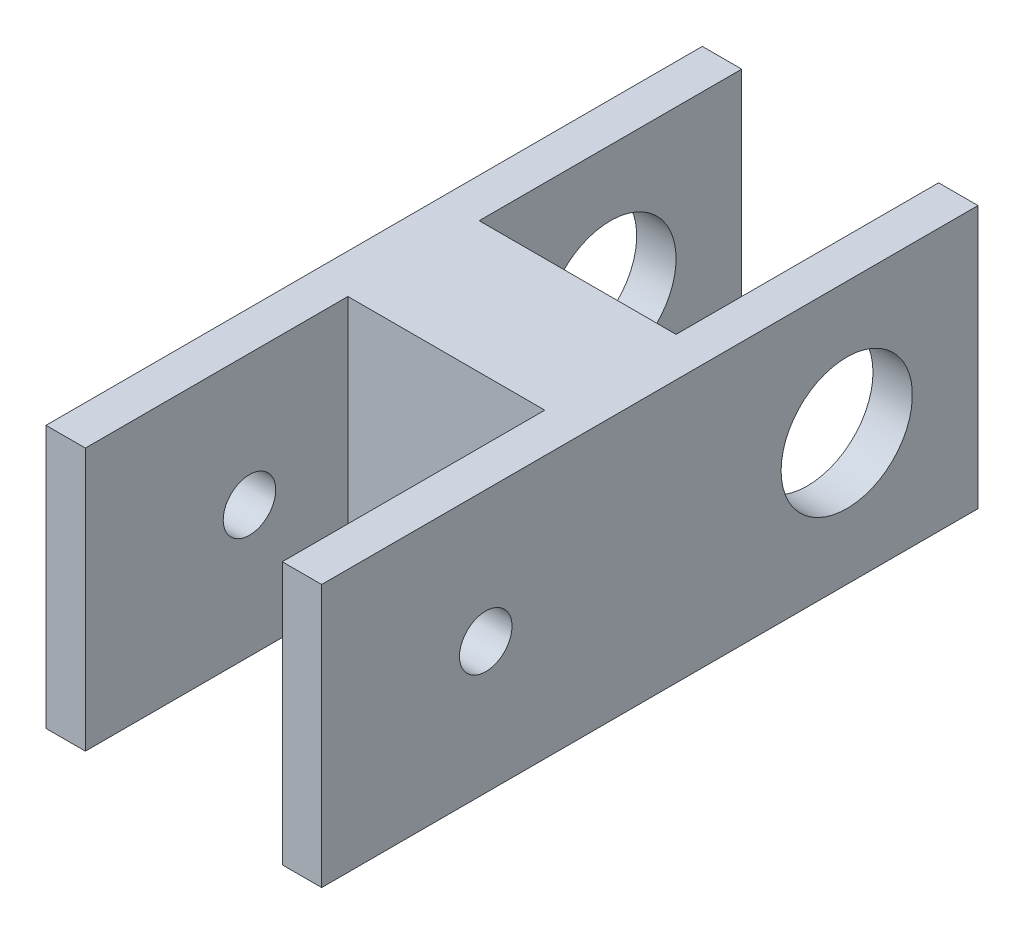
ISO-10303-21;
HEADER;
FILE_DESCRIPTION(('STEP AP214'),'2;1');
FILE_NAME('part.step','',(''),(''),'','','');
FILE_SCHEMA(('AUTOMOTIVE_DESIGN { 1 0 10303 214 1 1 1 1 }'));
ENDSEC;
DATA;
#1=APPLICATION_CONTEXT('core data for automotive mechanical design processes');
#2=APPLICATION_PROTOCOL_DEFINITION('international standard','automotive_design',2000,#1);
#3=PRODUCT_CONTEXT('',#1,'mechanical');
#4=PRODUCT('Part','Part','',(#3));
#5=PRODUCT_RELATED_PRODUCT_CATEGORY('part','',(#4));
#6=PRODUCT_DEFINITION_FORMATION('','',#4);
#7=PRODUCT_DEFINITION_CONTEXT('part definition',#1,'design');
#8=PRODUCT_DEFINITION('design','',#6,#7);
#9=PRODUCT_DEFINITION_SHAPE('','',#8);
#10=(LENGTH_UNIT() NAMED_UNIT(*) SI_UNIT(.MILLI.,.METRE.));
#11=(NAMED_UNIT(*) PLANE_ANGLE_UNIT() SI_UNIT($,.RADIAN.));
#12=(NAMED_UNIT(*) SI_UNIT($,.STERADIAN.) SOLID_ANGLE_UNIT());
#13=UNCERTAINTY_MEASURE_WITH_UNIT(LENGTH_MEASURE(1.E-05),#10,'distance_accuracy_value','');
#14=(GEOMETRIC_REPRESENTATION_CONTEXT(3) GLOBAL_UNCERTAINTY_ASSIGNED_CONTEXT((#13)) GLOBAL_UNIT_ASSIGNED_CONTEXT((#10,
#11,#12)) REPRESENTATION_CONTEXT('',''));
#15=CARTESIAN_POINT('',(0.,0.,0.));
#16=DIRECTION('',(0.,0.,1.));
#17=DIRECTION('',(1.,0.,0.));
#18=AXIS2_PLACEMENT_3D('',#15,#16,#17);
#19=CARTESIAN_POINT('',(78.75,175.,-185.688263723351));
#20=DIRECTION('',(-1.,0.,0.));
#21=DIRECTION('',(0.,0.,1.));
#22=AXIS2_PLACEMENT_3D('',#19,#20,#21);
#23=PLANE('',#22);
#24=CARTESIAN_POINT('',(78.75,100.,95.561736276649));
#25=DIRECTION('',(-1.,0.,0.));
#26=DIRECTION('',(0.,0.,1.));
#27=AXIS2_PLACEMENT_3D('',#24,#25,#26);
#28=CIRCLE('',#27,15.);
#29=CARTESIAN_POINT('',(78.75,100.,110.561736276649));
#30=VERTEX_POINT('',#29);
#31=EDGE_CURVE('E311',#30,#30,#28,.T.);
#32=ORIENTED_EDGE('',*,*,#31,.T.);
#33=EDGE_LOOP('',(#32));
#34=FACE_BOUND('',#33,.T.);
#35=CARTESIAN_POINT('',(78.75,100.,-110.688263723351));
#36=DIRECTION('',(-1.,0.,0.));
#37=DIRECTION('',(0.,0.,1.));
#38=AXIS2_PLACEMENT_3D('',#35,#36,#37);
#39=CIRCLE('',#38,37.5);
#40=CARTESIAN_POINT('',(78.75,100.,-73.1882637233509));
#41=VERTEX_POINT('',#40);
#42=EDGE_CURVE('E176',#41,#41,#39,.T.);
#43=ORIENTED_EDGE('',*,*,#42,.T.);
#44=EDGE_LOOP('',(#43));
#45=FACE_BOUND('',#44,.T.);
#46=DIRECTION('',(0.,0.,-1.));
#47=VECTOR('',#46,1.);
#48=CARTESIAN_POINT('',(78.75,25.,-185.688263723351));
#49=LINE('',#48,#47);
#50=CARTESIAN_POINT('',(78.75,25.,189.311736276649));
#51=VERTEX_POINT('',#50);
#52=CARTESIAN_POINT('',(78.75,25.,-185.688263723351));
#53=VERTEX_POINT('',#52);
#54=EDGE_CURVE('E172',#51,#53,#49,.T.);
#55=ORIENTED_EDGE('',*,*,#54,.T.);
#56=DIRECTION('',(0.,-1.,0.));
#57=VECTOR('',#56,1.);
#58=CARTESIAN_POINT('',(78.75,175.,-185.688263723351));
#59=LINE('',#58,#57);
#60=CARTESIAN_POINT('',(78.75,175.,-185.688263723351));
#61=VERTEX_POINT('',#60);
#62=EDGE_CURVE('E12',#61,#53,#59,.T.);
#63=ORIENTED_EDGE('',*,*,#62,.F.);
#64=DIRECTION('',(0.,0.,-1.));
#65=VECTOR('',#64,1.);
#66=CARTESIAN_POINT('',(78.75,175.,-185.688263723351));
#67=LINE('',#66,#65);
#68=CARTESIAN_POINT('',(78.75,175.,189.311736276649));
#69=VERTEX_POINT('',#68);
#70=EDGE_CURVE('E207',#69,#61,#67,.T.);
#71=ORIENTED_EDGE('',*,*,#70,.F.);
#72=DIRECTION('',(0.,-1.,0.));
#73=VECTOR('',#72,1.);
#74=CARTESIAN_POINT('',(78.75,175.,189.311736276649));
#75=LINE('',#74,#73);
#76=EDGE_CURVE('E168',#69,#51,#75,.T.);
#77=ORIENTED_EDGE('',*,*,#76,.T.);
#78=EDGE_LOOP('',(#55,#63,#71,#77));
#79=FACE_BOUND('',#78,.T.);
#80=ADVANCED_FACE('F48',(#34,#45,#79),#23,.F.);
#81=CARTESIAN_POINT('',(56.25,175.,-185.688263723351));
#82=DIRECTION('',(0.,0.,1.));
#83=DIRECTION('',(1.,0.,0.));
#84=AXIS2_PLACEMENT_3D('',#81,#82,#83);
#85=PLANE('',#84);
#86=DIRECTION('',(-1.,0.,0.));
#87=VECTOR('',#86,1.);
#88=CARTESIAN_POINT('',(56.25,25.,-185.688263723351));
#89=LINE('',#88,#87);
#90=CARTESIAN_POINT('',(56.25,25.,-185.688263723351));
#91=VERTEX_POINT('',#90);
#92=EDGE_CURVE('E180',#53,#91,#89,.T.);
#93=ORIENTED_EDGE('',*,*,#92,.T.);
#94=DIRECTION('',(0.,-1.,0.));
#95=VECTOR('',#94,1.);
#96=CARTESIAN_POINT('',(56.25,175.,-185.688263723351));
#97=LINE('',#96,#95);
#98=CARTESIAN_POINT('',(56.25,175.,-185.688263723351));
#99=VERTEX_POINT('',#98);
#100=EDGE_CURVE('E59',#99,#91,#97,.T.);
#101=ORIENTED_EDGE('',*,*,#100,.F.);
#102=DIRECTION('',(-1.,0.,0.));
#103=VECTOR('',#102,1.);
#104=CARTESIAN_POINT('',(56.25,175.,-185.688263723351));
#105=LINE('',#104,#103);
#106=EDGE_CURVE('E122',#61,#99,#105,.T.);
#107=ORIENTED_EDGE('',*,*,#106,.F.);
#108=ORIENTED_EDGE('',*,*,#62,.T.);
#109=EDGE_LOOP('',(#93,#101,#107,#108));
#110=FACE_BOUND('',#109,.T.);
#111=ADVANCED_FACE('F303',(#110),#85,.F.);
#112=CARTESIAN_POINT('',(56.25,175.,-185.688263723351));
#113=DIRECTION('',(1.,0.,0.));
#114=DIRECTION('',(0.,0.,-1.));
#115=AXIS2_PLACEMENT_3D('',#112,#113,#114);
#116=PLANE('',#115);
#117=CARTESIAN_POINT('',(56.25,100.,-110.688263723351));
#118=DIRECTION('',(1.,0.,0.));
#119=DIRECTION('',(0.,0.,-1.));
#120=AXIS2_PLACEMENT_3D('',#117,#118,#119);
#121=CIRCLE('',#120,37.5);
#122=CARTESIAN_POINT('',(56.25,100.,-148.188263723351));
#123=VERTEX_POINT('',#122);
#124=EDGE_CURVE('E318',#123,#123,#121,.T.);
#125=ORIENTED_EDGE('',*,*,#124,.T.);
#126=EDGE_LOOP('',(#125));
#127=FACE_BOUND('',#126,.T.);
#128=DIRECTION('',(0.,0.,1.));
#129=VECTOR('',#128,1.);
#130=CARTESIAN_POINT('',(56.25,25.,-185.688263723351));
#131=LINE('',#130,#129);
#132=CARTESIAN_POINT('',(56.25,25.,-35.6882637233509));
#133=VERTEX_POINT('',#132);
#134=EDGE_CURVE('E185',#91,#133,#131,.T.);
#135=ORIENTED_EDGE('',*,*,#134,.T.);
#136=DIRECTION('',(0.,-1.,0.));
#137=VECTOR('',#136,1.);
#138=CARTESIAN_POINT('',(56.25,175.,-35.6882637233509));
#139=LINE('',#138,#137);
#140=CARTESIAN_POINT('',(56.25,175.,-35.6882637233509));
#141=VERTEX_POINT('',#140);
#142=EDGE_CURVE('E237',#141,#133,#139,.T.);
#143=ORIENTED_EDGE('',*,*,#142,.F.);
#144=DIRECTION('',(0.,0.,1.));
#145=VECTOR('',#144,1.);
#146=CARTESIAN_POINT('',(56.25,175.,-185.688263723351));
#147=LINE('',#146,#145);
#148=EDGE_CURVE('E249',#99,#141,#147,.T.);
#149=ORIENTED_EDGE('',*,*,#148,.F.);
#150=ORIENTED_EDGE('',*,*,#100,.T.);
#151=EDGE_LOOP('',(#135,#143,#149,#150));
#152=FACE_BOUND('',#151,.T.);
#153=ADVANCED_FACE('F244',(#127,#152),#116,.F.);
#154=CARTESIAN_POINT('',(-56.25,175.,-35.6882637233509));
#155=DIRECTION('',(0.,0.,1.));
#156=DIRECTION('',(1.,0.,0.));
#157=AXIS2_PLACEMENT_3D('',#154,#155,#156);
#158=PLANE('',#157);
#159=DIRECTION('',(-1.,0.,0.));
#160=VECTOR('',#159,1.);
#161=CARTESIAN_POINT('',(-56.25,25.,-35.6882637233509));
#162=LINE('',#161,#160);
#163=CARTESIAN_POINT('',(-56.25,25.,-35.6882637233509));
#164=VERTEX_POINT('',#163);
#165=EDGE_CURVE('E183',#133,#164,#162,.T.);
#166=ORIENTED_EDGE('',*,*,#165,.T.);
#167=DIRECTION('',(0.,-1.,0.));
#168=VECTOR('',#167,1.);
#169=CARTESIAN_POINT('',(-56.25,175.,-35.6882637233509));
#170=LINE('',#169,#168);
#171=CARTESIAN_POINT('',(-56.25,175.,-35.6882637233509));
#172=VERTEX_POINT('',#171);
#173=EDGE_CURVE('E234',#172,#164,#170,.T.);
#174=ORIENTED_EDGE('',*,*,#173,.F.);
#175=DIRECTION('',(-1.,0.,0.));
#176=VECTOR('',#175,1.);
#177=CARTESIAN_POINT('',(-56.25,175.,-35.6882637233509));
#178=LINE('',#177,#176);
#179=EDGE_CURVE('E266',#141,#172,#178,.T.);
#180=ORIENTED_EDGE('',*,*,#179,.F.);
#181=ORIENTED_EDGE('',*,*,#142,.T.);
#182=EDGE_LOOP('',(#166,#174,#180,#181));
#183=FACE_BOUND('',#182,.T.);
#184=ADVANCED_FACE('F258',(#183),#158,.F.);
#185=CARTESIAN_POINT('',(-56.25,175.,-185.688263723351));
#186=DIRECTION('',(-1.,0.,0.));
#187=DIRECTION('',(0.,0.,1.));
#188=AXIS2_PLACEMENT_3D('',#185,#186,#187);
#189=PLANE('',#188);
#190=CARTESIAN_POINT('',(-56.25,100.,-110.688263723351));
#191=DIRECTION('',(-1.,0.,0.));
#192=DIRECTION('',(0.,0.,1.));
#193=AXIS2_PLACEMENT_3D('',#190,#191,#192);
#194=CIRCLE('',#193,37.5);
#195=CARTESIAN_POINT('',(-56.25,100.,-73.1882637233509));
#196=VERTEX_POINT('',#195);
#197=EDGE_CURVE('E325',#196,#196,#194,.T.);
#198=ORIENTED_EDGE('',*,*,#197,.T.);
#199=EDGE_LOOP('',(#198));
#200=FACE_BOUND('',#199,.T.);
#201=DIRECTION('',(0.,0.,-1.));
#202=VECTOR('',#201,1.);
#203=CARTESIAN_POINT('',(-56.25,25.,-185.688263723351));
#204=LINE('',#203,#202);
#205=CARTESIAN_POINT('',(-56.25,25.,-185.688263723351));
#206=VERTEX_POINT('',#205);
#207=EDGE_CURVE('E186',#164,#206,#204,.T.);
#208=ORIENTED_EDGE('',*,*,#207,.T.);
#209=DIRECTION('',(0.,-1.,0.));
#210=VECTOR('',#209,1.);
#211=CARTESIAN_POINT('',(-56.25,175.,-185.688263723351));
#212=LINE('',#211,#210);
#213=CARTESIAN_POINT('',(-56.25,175.,-185.688263723351));
#214=VERTEX_POINT('',#213);
#215=EDGE_CURVE('E226',#214,#206,#212,.T.);
#216=ORIENTED_EDGE('',*,*,#215,.F.);
#217=DIRECTION('',(0.,0.,-1.));
#218=VECTOR('',#217,1.);
#219=CARTESIAN_POINT('',(-56.25,175.,-185.688263723351));
#220=LINE('',#219,#218);
#221=EDGE_CURVE('E265',#172,#214,#220,.T.);
#222=ORIENTED_EDGE('',*,*,#221,.F.);
#223=ORIENTED_EDGE('',*,*,#173,.T.);
#224=EDGE_LOOP('',(#208,#216,#222,#223));
#225=FACE_BOUND('',#224,.T.);
#226=ADVANCED_FACE('F257',(#200,#225),#189,.F.);
#227=CARTESIAN_POINT('',(-78.75,175.,-185.688263723351));
#228=DIRECTION('',(0.,0.,1.));
#229=DIRECTION('',(1.,0.,0.));
#230=AXIS2_PLACEMENT_3D('',#227,#228,#229);
#231=PLANE('',#230);
#232=DIRECTION('',(-1.,0.,0.));
#233=VECTOR('',#232,1.);
#234=CARTESIAN_POINT('',(-78.75,25.,-185.688263723351));
#235=LINE('',#234,#233);
#236=CARTESIAN_POINT('',(-78.75,25.,-185.688263723351));
#237=VERTEX_POINT('',#236);
#238=EDGE_CURVE('E192',#206,#237,#235,.T.);
#239=ORIENTED_EDGE('',*,*,#238,.T.);
#240=DIRECTION('',(0.,-1.,0.));
#241=VECTOR('',#240,1.);
#242=CARTESIAN_POINT('',(-78.75,175.,-185.688263723351));
#243=LINE('',#242,#241);
#244=CARTESIAN_POINT('',(-78.75,175.,-185.688263723351));
#245=VERTEX_POINT('',#244);
#246=EDGE_CURVE('E221',#245,#237,#243,.T.);
#247=ORIENTED_EDGE('',*,*,#246,.F.);
#248=DIRECTION('',(-1.,0.,0.));
#249=VECTOR('',#248,1.);
#250=CARTESIAN_POINT('',(-78.75,175.,-185.688263723351));
#251=LINE('',#250,#249);
#252=EDGE_CURVE('E264',#214,#245,#251,.T.);
#253=ORIENTED_EDGE('',*,*,#252,.F.);
#254=ORIENTED_EDGE('',*,*,#215,.T.);
#255=EDGE_LOOP('',(#239,#247,#253,#254));
#256=FACE_BOUND('',#255,.T.);
#257=ADVANCED_FACE('F381',(#256),#231,.F.);
#258=CARTESIAN_POINT('',(-78.75,175.,-185.688263723351));
#259=DIRECTION('',(1.,0.,0.));
#260=DIRECTION('',(0.,0.,-1.));
#261=AXIS2_PLACEMENT_3D('',#258,#259,#260);
#262=PLANE('',#261);
#263=CARTESIAN_POINT('',(-78.75,100.,95.5617362766491));
#264=DIRECTION('',(-1.,0.,0.));
#265=DIRECTION('',(0.,0.,1.));
#266=AXIS2_PLACEMENT_3D('',#263,#264,#265);
#267=CIRCLE('',#266,15.);
#268=CARTESIAN_POINT('',(-78.75,100.,110.561736276649));
#269=VERTEX_POINT('',#268);
#270=EDGE_CURVE('E345',#269,#269,#267,.T.);
#271=ORIENTED_EDGE('',*,*,#270,.F.);
#272=EDGE_LOOP('',(#271));
#273=FACE_BOUND('',#272,.T.);
#274=CARTESIAN_POINT('',(-78.75,100.,-110.688263723351));
#275=DIRECTION('',(-1.,0.,0.));
#276=DIRECTION('',(0.,0.,1.));
#277=AXIS2_PLACEMENT_3D('',#274,#275,#276);
#278=CIRCLE('',#277,37.5);
#279=CARTESIAN_POINT('',(-78.75,100.,-73.1882637233509));
#280=VERTEX_POINT('',#279);
#281=EDGE_CURVE('E337',#280,#280,#278,.T.);
#282=ORIENTED_EDGE('',*,*,#281,.F.);
#283=EDGE_LOOP('',(#282));
#284=FACE_BOUND('',#283,.T.);
#285=DIRECTION('',(0.,0.,1.));
#286=VECTOR('',#285,1.);
#287=CARTESIAN_POINT('',(-78.75,25.,-185.688263723351));
#288=LINE('',#287,#286);
#289=CARTESIAN_POINT('',(-78.75,25.,189.311736276649));
#290=VERTEX_POINT('',#289);
#291=EDGE_CURVE('E191',#237,#290,#288,.T.);
#292=ORIENTED_EDGE('',*,*,#291,.T.);
#293=DIRECTION('',(0.,-1.,0.));
#294=VECTOR('',#293,1.);
#295=CARTESIAN_POINT('',(-78.75,175.,189.311736276649));
#296=LINE('',#295,#294);
#297=CARTESIAN_POINT('',(-78.75,175.,189.311736276649));
#298=VERTEX_POINT('',#297);
#299=EDGE_CURVE('E219',#298,#290,#296,.T.);
#300=ORIENTED_EDGE('',*,*,#299,.F.);
#301=DIRECTION('',(0.,0.,1.));
#302=VECTOR('',#301,1.);
#303=CARTESIAN_POINT('',(-78.75,175.,-185.688263723351));
#304=LINE('',#303,#302);
#305=EDGE_CURVE('E269',#245,#298,#304,.T.);
#306=ORIENTED_EDGE('',*,*,#305,.F.);
#307=ORIENTED_EDGE('',*,*,#246,.T.);
#308=EDGE_LOOP('',(#292,#300,#306,#307));
#309=FACE_BOUND('',#308,.T.);
#310=ADVANCED_FACE('F384',(#273,#284,#309),#262,.F.);
#311=CARTESIAN_POINT('',(-78.75,175.,189.311736276649));
#312=DIRECTION('',(0.,0.,-1.));
#313=DIRECTION('',(-1.,0.,0.));
#314=AXIS2_PLACEMENT_3D('',#311,#312,#313);
#315=PLANE('',#314);
#316=DIRECTION('',(1.,0.,0.));
#317=VECTOR('',#316,1.);
#318=CARTESIAN_POINT('',(-78.75,25.,189.311736276649));
#319=LINE('',#318,#317);
#320=CARTESIAN_POINT('',(-56.25,25.,189.311736276649));
#321=VERTEX_POINT('',#320);
#322=EDGE_CURVE('E197',#290,#321,#319,.T.);
#323=ORIENTED_EDGE('',*,*,#322,.T.);
#324=DIRECTION('',(0.,-1.,0.));
#325=VECTOR('',#324,1.);
#326=CARTESIAN_POINT('',(-56.25,175.,189.311736276649));
#327=LINE('',#326,#325);
#328=CARTESIAN_POINT('',(-56.25,175.,189.311736276649));
#329=VERTEX_POINT('',#328);
#330=EDGE_CURVE('E216',#329,#321,#327,.T.);
#331=ORIENTED_EDGE('',*,*,#330,.F.);
#332=DIRECTION('',(1.,0.,0.));
#333=VECTOR('',#332,1.);
#334=CARTESIAN_POINT('',(-78.75,175.,189.311736276649));
#335=LINE('',#334,#333);
#336=EDGE_CURVE('E280',#298,#329,#335,.T.);
#337=ORIENTED_EDGE('',*,*,#336,.F.);
#338=ORIENTED_EDGE('',*,*,#299,.T.);
#339=EDGE_LOOP('',(#323,#331,#337,#338));
#340=FACE_BOUND('',#339,.T.);
#341=ADVANCED_FACE('F284',(#340),#315,.F.);
#342=CARTESIAN_POINT('',(-56.25,175.,189.311736276649));
#343=DIRECTION('',(-1.,0.,0.));
#344=DIRECTION('',(0.,0.,1.));
#345=AXIS2_PLACEMENT_3D('',#342,#343,#344);
#346=PLANE('',#345);
#347=CARTESIAN_POINT('',(-56.25,100.,95.5617362766491));
#348=DIRECTION('',(-1.,0.,0.));
#349=DIRECTION('',(0.,0.,1.));
#350=AXIS2_PLACEMENT_3D('',#347,#348,#349);
#351=CIRCLE('',#350,15.);
#352=CARTESIAN_POINT('',(-56.25,100.,110.561736276649));
#353=VERTEX_POINT('',#352);
#354=EDGE_CURVE('E333',#353,#353,#351,.T.);
#355=ORIENTED_EDGE('',*,*,#354,.T.);
#356=EDGE_LOOP('',(#355));
#357=FACE_BOUND('',#356,.T.);
#358=DIRECTION('',(0.,0.,-1.));
#359=VECTOR('',#358,1.);
#360=CARTESIAN_POINT('',(-56.25,25.,189.311736276649));
#361=LINE('',#360,#359);
#362=CARTESIAN_POINT('',(-56.25,25.,39.3117362766491));
#363=VERTEX_POINT('',#362);
#364=EDGE_CURVE('E199',#321,#363,#361,.T.);
#365=ORIENTED_EDGE('',*,*,#364,.T.);
#366=DIRECTION('',(0.,-1.,0.));
#367=VECTOR('',#366,1.);
#368=CARTESIAN_POINT('',(-56.25,175.,39.3117362766491));
#369=LINE('',#368,#367);
#370=CARTESIAN_POINT('',(-56.25,175.,39.3117362766491));
#371=VERTEX_POINT('',#370);
#372=EDGE_CURVE('E162',#371,#363,#369,.T.);
#373=ORIENTED_EDGE('',*,*,#372,.F.);
#374=DIRECTION('',(0.,0.,-1.));
#375=VECTOR('',#374,1.);
#376=CARTESIAN_POINT('',(-56.25,175.,189.311736276649));
#377=LINE('',#376,#375);
#378=EDGE_CURVE('E155',#329,#371,#377,.T.);
#379=ORIENTED_EDGE('',*,*,#378,.F.);
#380=ORIENTED_EDGE('',*,*,#330,.T.);
#381=EDGE_LOOP('',(#365,#373,#379,#380));
#382=FACE_BOUND('',#381,.T.);
#383=ADVANCED_FACE('F286',(#357,#382),#346,.F.);
#384=CARTESIAN_POINT('',(-56.25,175.,39.3117362766491));
#385=DIRECTION('',(0.,0.,-1.));
#386=DIRECTION('',(-1.,0.,0.));
#387=AXIS2_PLACEMENT_3D('',#384,#385,#386);
#388=PLANE('',#387);
#389=DIRECTION('',(1.,0.,0.));
#390=VECTOR('',#389,1.);
#391=CARTESIAN_POINT('',(-56.25,25.,39.3117362766491));
#392=LINE('',#391,#390);
#393=CARTESIAN_POINT('',(56.25,25.,39.3117362766491));
#394=VERTEX_POINT('',#393);
#395=EDGE_CURVE('E161',#363,#394,#392,.T.);
#396=ORIENTED_EDGE('',*,*,#395,.T.);
#397=DIRECTION('',(0.,-1.,0.));
#398=VECTOR('',#397,1.);
#399=CARTESIAN_POINT('',(56.25,175.,39.3117362766491));
#400=LINE('',#399,#398);
#401=CARTESIAN_POINT('',(56.25,175.,39.3117362766491));
#402=VERTEX_POINT('',#401);
#403=EDGE_CURVE('E158',#402,#394,#400,.T.);
#404=ORIENTED_EDGE('',*,*,#403,.F.);
#405=DIRECTION('',(1.,0.,0.));
#406=VECTOR('',#405,1.);
#407=CARTESIAN_POINT('',(-56.25,175.,39.3117362766491));
#408=LINE('',#407,#406);
#409=EDGE_CURVE('E148',#371,#402,#408,.T.);
#410=ORIENTED_EDGE('',*,*,#409,.F.);
#411=ORIENTED_EDGE('',*,*,#372,.T.);
#412=EDGE_LOOP('',(#396,#404,#410,#411));
#413=FACE_BOUND('',#412,.T.);
#414=ADVANCED_FACE('F157',(#413),#388,.F.);
#415=CARTESIAN_POINT('',(56.25,175.,189.311736276649));
#416=DIRECTION('',(1.,0.,0.));
#417=DIRECTION('',(0.,0.,-1.));
#418=AXIS2_PLACEMENT_3D('',#415,#416,#417);
#419=PLANE('',#418);
#420=CARTESIAN_POINT('',(56.25,100.,95.561736276649));
#421=DIRECTION('',(1.,0.,0.));
#422=DIRECTION('',(0.,0.,-1.));
#423=AXIS2_PLACEMENT_3D('',#420,#421,#422);
#424=CIRCLE('',#423,15.);
#425=CARTESIAN_POINT('',(56.25,100.,80.561736276649));
#426=VERTEX_POINT('',#425);
#427=EDGE_CURVE('E51',#426,#426,#424,.T.);
#428=ORIENTED_EDGE('',*,*,#427,.T.);
#429=EDGE_LOOP('',(#428));
#430=FACE_BOUND('',#429,.T.);
#431=DIRECTION('',(0.,0.,1.));
#432=VECTOR('',#431,1.);
#433=CARTESIAN_POINT('',(56.25,25.,189.311736276649));
#434=LINE('',#433,#432);
#435=CARTESIAN_POINT('',(56.25,25.,189.311736276649));
#436=VERTEX_POINT('',#435);
#437=EDGE_CURVE('E110',#394,#436,#434,.T.);
#438=ORIENTED_EDGE('',*,*,#437,.T.);
#439=DIRECTION('',(0.,-1.,0.));
#440=VECTOR('',#439,1.);
#441=CARTESIAN_POINT('',(56.25,175.,189.311736276649));
#442=LINE('',#441,#440);
#443=CARTESIAN_POINT('',(56.25,175.,189.311736276649));
#444=VERTEX_POINT('',#443);
#445=EDGE_CURVE('E163',#444,#436,#442,.T.);
#446=ORIENTED_EDGE('',*,*,#445,.F.);
#447=DIRECTION('',(0.,0.,1.));
#448=VECTOR('',#447,1.);
#449=CARTESIAN_POINT('',(56.25,175.,189.311736276649));
#450=LINE('',#449,#448);
#451=EDGE_CURVE('E147',#402,#444,#450,.T.);
#452=ORIENTED_EDGE('',*,*,#451,.F.);
#453=ORIENTED_EDGE('',*,*,#403,.T.);
#454=EDGE_LOOP('',(#438,#446,#452,#453));
#455=FACE_BOUND('',#454,.T.);
#456=ADVANCED_FACE('F167',(#430,#455),#419,.F.);
#457=CARTESIAN_POINT('',(56.25,175.,189.311736276649));
#458=DIRECTION('',(0.,0.,-1.));
#459=DIRECTION('',(-1.,0.,0.));
#460=AXIS2_PLACEMENT_3D('',#457,#458,#459);
#461=PLANE('',#460);
#462=DIRECTION('',(1.,0.,0.));
#463=VECTOR('',#462,1.);
#464=CARTESIAN_POINT('',(56.25,25.,189.311736276649));
#465=LINE('',#464,#463);
#466=EDGE_CURVE('E114',#436,#51,#465,.T.);
#467=ORIENTED_EDGE('',*,*,#466,.T.);
#468=ORIENTED_EDGE('',*,*,#76,.F.);
#469=DIRECTION('',(1.,0.,0.));
#470=VECTOR('',#469,1.);
#471=CARTESIAN_POINT('',(56.25,175.,189.311736276649));
#472=LINE('',#471,#470);
#473=EDGE_CURVE('E67',#444,#69,#472,.T.);
#474=ORIENTED_EDGE('',*,*,#473,.F.);
#475=ORIENTED_EDGE('',*,*,#445,.T.);
#476=EDGE_LOOP('',(#467,#468,#474,#475));
#477=FACE_BOUND('',#476,.T.);
#478=ADVANCED_FACE('F291',(#477),#461,.F.);
#479=CARTESIAN_POINT('',(0.,175.,1.81173627664909));
#480=DIRECTION('',(0.,1.,0.));
#481=DIRECTION('',(0.,0.,1.));
#482=AXIS2_PLACEMENT_3D('',#479,#480,#481);
#483=PLANE('',#482);
#484=ORIENTED_EDGE('',*,*,#70,.T.);
#485=ORIENTED_EDGE('',*,*,#106,.T.);
#486=ORIENTED_EDGE('',*,*,#148,.T.);
#487=ORIENTED_EDGE('',*,*,#179,.T.);
#488=ORIENTED_EDGE('',*,*,#221,.T.);
#489=ORIENTED_EDGE('',*,*,#252,.T.);
#490=ORIENTED_EDGE('',*,*,#305,.T.);
#491=ORIENTED_EDGE('',*,*,#336,.T.);
#492=ORIENTED_EDGE('',*,*,#378,.T.);
#493=ORIENTED_EDGE('',*,*,#409,.T.);
#494=ORIENTED_EDGE('',*,*,#451,.T.);
#495=ORIENTED_EDGE('',*,*,#473,.T.);
#496=EDGE_LOOP('',(#484,#485,#486,#487,#488,#489,#490,#491,#492,#493,#494,#495));
#497=FACE_BOUND('',#496,.T.);
#498=ADVANCED_FACE('F146',(#497),#483,.T.);
#499=CARTESIAN_POINT('',(0.,25.,1.81173627664909));
#500=DIRECTION('',(0.,1.,0.));
#501=DIRECTION('',(0.,0.,1.));
#502=AXIS2_PLACEMENT_3D('',#499,#500,#501);
#503=PLANE('',#502);
#504=ORIENTED_EDGE('',*,*,#54,.F.);
#505=ORIENTED_EDGE('',*,*,#466,.F.);
#506=ORIENTED_EDGE('',*,*,#437,.F.);
#507=ORIENTED_EDGE('',*,*,#395,.F.);
#508=ORIENTED_EDGE('',*,*,#364,.F.);
#509=ORIENTED_EDGE('',*,*,#322,.F.);
#510=ORIENTED_EDGE('',*,*,#291,.F.);
#511=ORIENTED_EDGE('',*,*,#238,.F.);
#512=ORIENTED_EDGE('',*,*,#207,.F.);
#513=ORIENTED_EDGE('',*,*,#165,.F.);
#514=ORIENTED_EDGE('',*,*,#134,.F.);
#515=ORIENTED_EDGE('',*,*,#92,.F.);
#516=EDGE_LOOP('',(#504,#505,#506,#507,#508,#509,#510,#511,#512,#513,#514,#515));
#517=FACE_BOUND('',#516,.T.);
#518=ADVANCED_FACE('F253',(#517),#503,.F.);
#519=CARTESIAN_POINT('',(156.,100.,95.561736276649));
#520=DIRECTION('',(-1.,0.,0.));
#521=DIRECTION('',(0.,0.,1.));
#522=AXIS2_PLACEMENT_3D('',#519,#520,#521);
#523=CYLINDRICAL_SURFACE('',#522,15.);
#524=ORIENTED_EDGE('',*,*,#427,.F.);
#525=EDGE_LOOP('',(#524));
#526=FACE_BOUND('',#525,.T.);
#527=ORIENTED_EDGE('',*,*,#31,.F.);
#528=EDGE_LOOP('',(#527));
#529=FACE_BOUND('',#528,.T.);
#530=ADVANCED_FACE('F355',(#526,#529),#523,.F.);
#531=ORIENTED_EDGE('',*,*,#270,.T.);
#532=EDGE_LOOP('',(#531));
#533=FACE_BOUND('',#532,.T.);
#534=ORIENTED_EDGE('',*,*,#354,.F.);
#535=EDGE_LOOP('',(#534));
#536=FACE_BOUND('',#535,.T.);
#537=ADVANCED_FACE('F354',(#533,#536),#523,.F.);
#538=CARTESIAN_POINT('',(156.,100.,-110.688263723351));
#539=DIRECTION('',(-1.,0.,0.));
#540=DIRECTION('',(0.,0.,1.));
#541=AXIS2_PLACEMENT_3D('',#538,#539,#540);
#542=CYLINDRICAL_SURFACE('',#541,37.5);
#543=ORIENTED_EDGE('',*,*,#281,.T.);
#544=EDGE_LOOP('',(#543));
#545=FACE_BOUND('',#544,.T.);
#546=ORIENTED_EDGE('',*,*,#197,.F.);
#547=EDGE_LOOP('',(#546));
#548=FACE_BOUND('',#547,.T.);
#549=ADVANCED_FACE('F363',(#545,#548),#542,.F.);
#550=ORIENTED_EDGE('',*,*,#124,.F.);
#551=EDGE_LOOP('',(#550));
#552=FACE_BOUND('',#551,.T.);
#553=ORIENTED_EDGE('',*,*,#42,.F.);
#554=EDGE_LOOP('',(#553));
#555=FACE_BOUND('',#554,.T.);
#556=ADVANCED_FACE('F361',(#552,#555),#542,.F.);
#557=CLOSED_SHELL('',(#80,#111,#153,#184,#226,#257,#310,#341,#383,#414,#456,#478,#498,#518,#530,
#537,#549,#556));
#558=MANIFOLD_SOLID_BREP('B2',#557);
#559=ADVANCED_BREP_SHAPE_REPRESENTATION('',(#18,#558),#14);
#560=SHAPE_DEFINITION_REPRESENTATION(#9,#559);
ENDSEC;
END-ISO-10303-21;
